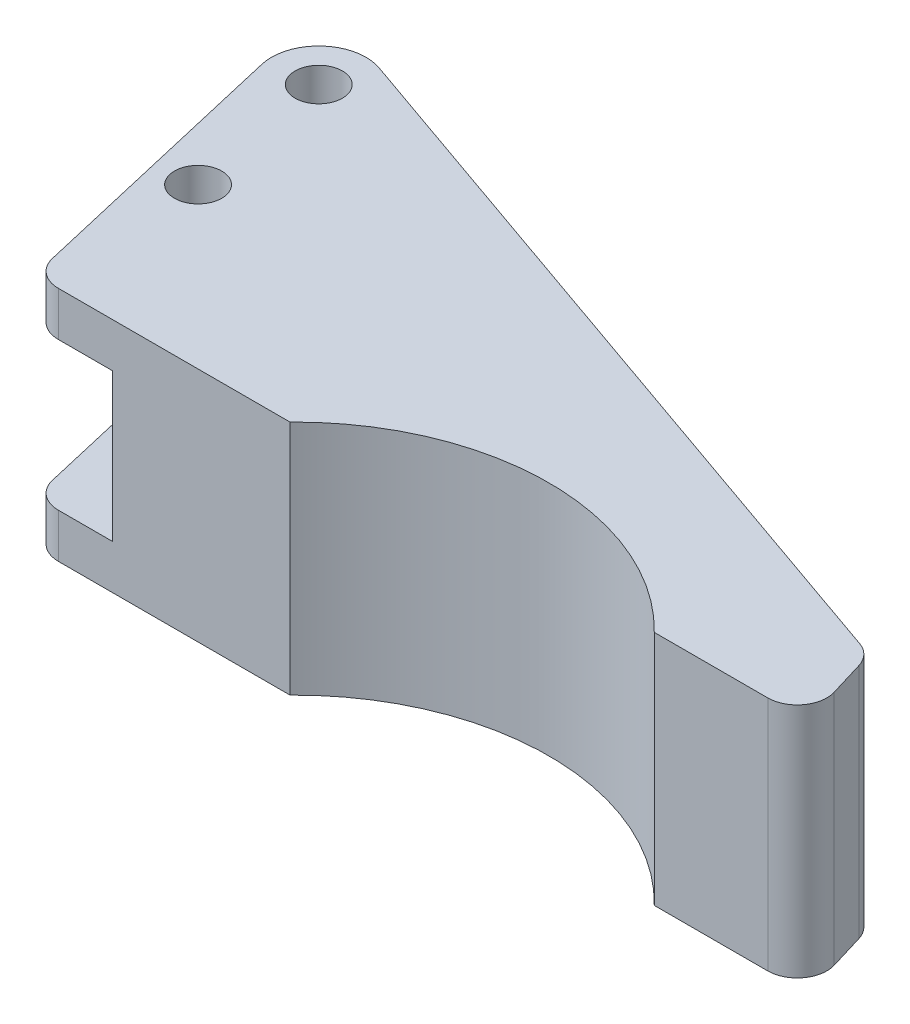
ISO-10303-21;
HEADER;
FILE_DESCRIPTION(('STEP AP214'),'2;1');
FILE_NAME('part.step','',(''),(''),'','','');
FILE_SCHEMA(('AUTOMOTIVE_DESIGN { 1 0 10303 214 1 1 1 1 }'));
ENDSEC;
DATA;
#1=APPLICATION_CONTEXT('core data for automotive mechanical design processes');
#2=APPLICATION_PROTOCOL_DEFINITION('international standard','automotive_design',2000,#1);
#3=PRODUCT_CONTEXT('',#1,'mechanical');
#4=PRODUCT('Part','Part','',(#3));
#5=PRODUCT_RELATED_PRODUCT_CATEGORY('part','',(#4));
#6=PRODUCT_DEFINITION_FORMATION('','',#4);
#7=PRODUCT_DEFINITION_CONTEXT('part definition',#1,'design');
#8=PRODUCT_DEFINITION('design','',#6,#7);
#9=PRODUCT_DEFINITION_SHAPE('','',#8);
#10=(LENGTH_UNIT() NAMED_UNIT(*) SI_UNIT(.MILLI.,.METRE.));
#11=(NAMED_UNIT(*) PLANE_ANGLE_UNIT() SI_UNIT($,.RADIAN.));
#12=(NAMED_UNIT(*) SI_UNIT($,.STERADIAN.) SOLID_ANGLE_UNIT());
#13=UNCERTAINTY_MEASURE_WITH_UNIT(LENGTH_MEASURE(1.E-05),#10,'distance_accuracy_value','');
#14=(GEOMETRIC_REPRESENTATION_CONTEXT(3) GLOBAL_UNCERTAINTY_ASSIGNED_CONTEXT((#13)) GLOBAL_UNIT_ASSIGNED_CONTEXT((#10,
#11,#12)) REPRESENTATION_CONTEXT('',''));
#15=CARTESIAN_POINT('',(0.,0.,0.));
#16=DIRECTION('',(0.,0.,1.));
#17=DIRECTION('',(1.,0.,0.));
#18=AXIS2_PLACEMENT_3D('',#15,#16,#17);
#19=CARTESIAN_POINT('',(-70.,20.,-4.99999999999999));
#20=DIRECTION('',(0.,-1.,0.));
#21=DIRECTION('',(0.,0.,-1.));
#22=AXIS2_PLACEMENT_3D('',#19,#20,#21);
#23=CYLINDRICAL_SURFACE('',#22,5.);
#24=DIRECTION('',(0.,-1.,0.));
#25=VECTOR('',#24,1.);
#26=CARTESIAN_POINT('',(-70.,20.,0.));
#27=LINE('',#26,#25);
#28=CARTESIAN_POINT('',(-70.,-12.5,0.));
#29=VERTEX_POINT('',#28);
#30=CARTESIAN_POINT('',(-70.,-20.,0.));
#31=VERTEX_POINT('',#30);
#32=EDGE_CURVE('E234',#29,#31,#27,.T.);
#33=ORIENTED_EDGE('',*,*,#32,.F.);
#34=CARTESIAN_POINT('',(-70.,-12.5,-4.99999999999999));
#35=DIRECTION('',(0.,-1.,0.));
#36=DIRECTION('',(0.,0.,-1.));
#37=AXIS2_PLACEMENT_3D('',#34,#35,#36);
#38=CIRCLE('',#37,5.);
#39=CARTESIAN_POINT('',(-74.8701653926543,-12.5,-3.86797126883076));
#40=VERTEX_POINT('',#39);
#41=EDGE_CURVE('E262',#29,#40,#38,.T.);
#42=ORIENTED_EDGE('',*,*,#41,.T.);
#43=DIRECTION('',(0.,-1.,0.));
#44=VECTOR('',#43,1.);
#45=CARTESIAN_POINT('',(-74.8701653926543,20.,-3.86797126883076));
#46=LINE('',#45,#44);
#47=CARTESIAN_POINT('',(-74.8701653926543,-20.,-3.86797126883076));
#48=VERTEX_POINT('',#47);
#49=EDGE_CURVE('E104',#40,#48,#46,.T.);
#50=ORIENTED_EDGE('',*,*,#49,.T.);
#51=CARTESIAN_POINT('',(-70.,-20.,-4.99999999999999));
#52=DIRECTION('',(0.,1.,0.));
#53=DIRECTION('',(0.,0.,-1.));
#54=AXIS2_PLACEMENT_3D('',#51,#52,#53);
#55=CIRCLE('',#54,5.);
#56=EDGE_CURVE('E171',#48,#31,#55,.T.);
#57=ORIENTED_EDGE('',*,*,#56,.T.);
#58=EDGE_LOOP('',(#33,#42,#50,#57));
#59=FACE_BOUND('',#58,.T.);
#60=ADVANCED_FACE('F39',(#59),#23,.T.);
#61=CARTESIAN_POINT('',(-77.8145573222842,20.,-51.87));
#62=DIRECTION('',(0.,-1.,0.));
#63=DIRECTION('',(0.,0.,-1.));
#64=AXIS2_PLACEMENT_3D('',#61,#62,#63);
#65=CYLINDRICAL_SURFACE('',#64,8.00000000000001);
#66=CARTESIAN_POINT('',(-77.8145573222842,12.5,-51.87));
#67=DIRECTION('',(0.,1.,0.));
#68=DIRECTION('',(0.,0.,1.));
#69=AXIS2_PLACEMENT_3D('',#66,#67,#68);
#70=CIRCLE('',#69,8.00000000000001);
#71=CARTESIAN_POINT('',(-75.1745573222842,12.5,-59.4218474560865));
#72=VERTEX_POINT('',#71);
#73=CARTESIAN_POINT('',(-85.6068219505311,12.5,-50.0587540301292));
#74=VERTEX_POINT('',#73);
#75=EDGE_CURVE('E253',#72,#74,#70,.T.);
#76=ORIENTED_EDGE('',*,*,#75,.T.);
#77=DIRECTION('',(0.,-1.,0.));
#78=VECTOR('',#77,1.);
#79=CARTESIAN_POINT('',(-85.6068219505311,20.,-50.0587540301292));
#80=LINE('',#79,#78);
#81=CARTESIAN_POINT('',(-85.6068219505311,20.,-50.0587540301292));
#82=VERTEX_POINT('',#81);
#83=EDGE_CURVE('E164',#82,#74,#80,.T.);
#84=ORIENTED_EDGE('',*,*,#83,.F.);
#85=CARTESIAN_POINT('',(-77.8145573222842,20.,-51.87));
#86=DIRECTION('',(0.,1.,0.));
#87=DIRECTION('',(0.,0.,1.));
#88=AXIS2_PLACEMENT_3D('',#85,#86,#87);
#89=CIRCLE('',#88,8.00000000000001);
#90=CARTESIAN_POINT('',(-75.1745573222842,20.,-59.4218474560865));
#91=VERTEX_POINT('',#90);
#92=EDGE_CURVE('E139',#91,#82,#89,.T.);
#93=ORIENTED_EDGE('',*,*,#92,.F.);
#94=DIRECTION('',(0.,-1.,0.));
#95=VECTOR('',#94,1.);
#96=CARTESIAN_POINT('',(-75.1745573222842,20.,-59.4218474560865));
#97=LINE('',#96,#95);
#98=EDGE_CURVE('E150',#91,#72,#97,.T.);
#99=ORIENTED_EDGE('',*,*,#98,.T.);
#100=EDGE_LOOP('',(#76,#84,#93,#99));
#101=FACE_BOUND('',#100,.T.);
#102=ADVANCED_FACE('F162',(#101),#65,.T.);
#103=CARTESIAN_POINT('',(-74.8701653926543,20.,-3.86797126883076));
#104=DIRECTION('',(0.974033078530855,0.,-0.226405746233846));
#105=DIRECTION('',(-0.226405746233846,0.,-0.974033078530855));
#106=AXIS2_PLACEMENT_3D('',#103,#104,#105);
#107=PLANE('',#106);
#108=ORIENTED_EDGE('',*,*,#49,.F.);
#109=DIRECTION('',(-0.226405746233846,0.,-0.974033078530855));
#110=VECTOR('',#109,1.);
#111=CARTESIAN_POINT('',(-74.8701653926543,-12.5,-3.86797126883076));
#112=LINE('',#111,#110);
#113=CARTESIAN_POINT('',(-85.6068219505311,-12.5,-50.0587540301292));
#114=VERTEX_POINT('',#113);
#115=EDGE_CURVE('E251',#40,#114,#112,.T.);
#116=ORIENTED_EDGE('',*,*,#115,.T.);
#117=CARTESIAN_POINT('',(-85.6068219505311,-20.,-50.0587540301292));
#118=VERTEX_POINT('',#117);
#119=EDGE_CURVE('E209',#114,#118,#80,.T.);
#120=ORIENTED_EDGE('',*,*,#119,.T.);
#121=DIRECTION('',(0.226405746233846,0.,0.974033078530855));
#122=VECTOR('',#121,1.);
#123=CARTESIAN_POINT('',(-74.8701653926543,-20.,-3.86797126883076));
#124=LINE('',#123,#122);
#125=EDGE_CURVE('E201',#118,#48,#124,.T.);
#126=ORIENTED_EDGE('',*,*,#125,.T.);
#127=EDGE_LOOP('',(#108,#116,#120,#126));
#128=FACE_BOUND('',#127,.T.);
#129=ADVANCED_FACE('F330',(#128),#107,.F.);
#130=CARTESIAN_POINT('',(-77.8145573222842,20.,-51.87));
#131=DIRECTION('',(0.,-1.,0.));
#132=DIRECTION('',(0.,0.,-1.));
#133=AXIS2_PLACEMENT_3D('',#130,#131,#132);
#134=CYLINDRICAL_SURFACE('',#133,4.00000000000001);
#135=CARTESIAN_POINT('',(-77.8145573222842,-12.5,-51.87));
#136=DIRECTION('',(0.,-1.,0.));
#137=DIRECTION('',(0.,0.,-1.));
#138=AXIS2_PLACEMENT_3D('',#135,#136,#137);
#139=CIRCLE('',#138,4.00000000000001);
#140=CARTESIAN_POINT('',(-77.8145573222842,-12.5,-55.87));
#141=VERTEX_POINT('',#140);
#142=EDGE_CURVE('E245',#141,#141,#139,.T.);
#143=ORIENTED_EDGE('',*,*,#142,.F.);
#144=EDGE_LOOP('',(#143));
#145=FACE_BOUND('',#144,.T.);
#146=CARTESIAN_POINT('',(-77.8145573222842,-20.,-51.87));
#147=DIRECTION('',(0.,1.,0.));
#148=DIRECTION('',(0.,0.,1.));
#149=AXIS2_PLACEMENT_3D('',#146,#147,#148);
#150=CIRCLE('',#149,4.00000000000001);
#151=CARTESIAN_POINT('',(-77.8145573222842,-20.,-47.87));
#152=VERTEX_POINT('',#151);
#153=EDGE_CURVE('E278',#152,#152,#150,.T.);
#154=ORIENTED_EDGE('',*,*,#153,.F.);
#155=EDGE_LOOP('',(#154));
#156=FACE_BOUND('',#155,.T.);
#157=ADVANCED_FACE('F494',(#145,#156),#134,.F.);
#158=CARTESIAN_POINT('',(-73.3600000000001,20.,-27.));
#159=DIRECTION('',(0.,-1.,0.));
#160=DIRECTION('',(0.,0.,-1.));
#161=AXIS2_PLACEMENT_3D('',#158,#159,#160);
#162=CYLINDRICAL_SURFACE('',#161,4.00000000000001);
#163=CARTESIAN_POINT('',(-73.3600000000001,-12.5,-27.));
#164=DIRECTION('',(0.,-1.,0.));
#165=DIRECTION('',(0.,0.,-1.));
#166=AXIS2_PLACEMENT_3D('',#163,#164,#165);
#167=CIRCLE('',#166,4.00000000000001);
#168=CARTESIAN_POINT('',(-73.3600000000001,-12.5,-31.));
#169=VERTEX_POINT('',#168);
#170=EDGE_CURVE('E242',#169,#169,#167,.T.);
#171=ORIENTED_EDGE('',*,*,#170,.F.);
#172=EDGE_LOOP('',(#171));
#173=FACE_BOUND('',#172,.T.);
#174=CARTESIAN_POINT('',(-73.3600000000001,-20.,-27.));
#175=DIRECTION('',(0.,1.,0.));
#176=DIRECTION('',(0.,0.,1.));
#177=AXIS2_PLACEMENT_3D('',#174,#175,#176);
#178=CIRCLE('',#177,4.00000000000001);
#179=CARTESIAN_POINT('',(-73.3600000000001,-20.,-23.));
#180=VERTEX_POINT('',#179);
#181=EDGE_CURVE('E273',#180,#180,#178,.T.);
#182=ORIENTED_EDGE('',*,*,#181,.F.);
#183=EDGE_LOOP('',(#182));
#184=FACE_BOUND('',#183,.T.);
#185=ADVANCED_FACE('F433',(#173,#184),#162,.F.);
#186=CARTESIAN_POINT('',(-70.,20.,-4.99999999999999));
#187=DIRECTION('',(0.,-1.,0.));
#188=DIRECTION('',(0.,0.,-1.));
#189=AXIS2_PLACEMENT_3D('',#186,#187,#188);
#190=PLANE('',#189);
#191=CARTESIAN_POINT('',(-70.,20.,-4.99999999999999));
#192=DIRECTION('',(0.,1.,0.));
#193=DIRECTION('',(0.,0.,-1.));
#194=AXIS2_PLACEMENT_3D('',#191,#192,#193);
#195=CIRCLE('',#194,5.);
#196=CARTESIAN_POINT('',(-74.8701653926543,20.,-3.86797126883076));
#197=VERTEX_POINT('',#196);
#198=CARTESIAN_POINT('',(-70.,20.,0.));
#199=VERTEX_POINT('',#198);
#200=EDGE_CURVE('E204',#197,#199,#195,.T.);
#201=ORIENTED_EDGE('',*,*,#200,.T.);
#202=DIRECTION('',(1.,0.,0.));
#203=VECTOR('',#202,1.);
#204=CARTESIAN_POINT('',(-30.8058436014987,20.,0.));
#205=LINE('',#204,#203);
#206=CARTESIAN_POINT('',(-30.8058436014987,20.,0.));
#207=VERTEX_POINT('',#206);
#208=EDGE_CURVE('E113',#199,#207,#205,.T.);
#209=ORIENTED_EDGE('',*,*,#208,.T.);
#210=CARTESIAN_POINT('',(0.,20.,30.));
#211=DIRECTION('',(0.,-1.,0.));
#212=DIRECTION('',(0.,0.,1.));
#213=AXIS2_PLACEMENT_3D('',#210,#211,#212);
#214=CIRCLE('',#213,43.);
#215=CARTESIAN_POINT('',(30.8058436014987,20.,0.));
#216=VERTEX_POINT('',#215);
#217=EDGE_CURVE('E292',#207,#216,#214,.T.);
#218=ORIENTED_EDGE('',*,*,#217,.T.);
#219=DIRECTION('',(1.,0.,0.));
#220=VECTOR('',#219,1.);
#221=CARTESIAN_POINT('',(50.,20.,0.));
#222=LINE('',#221,#220);
#223=CARTESIAN_POINT('',(50.,20.,0.));
#224=VERTEX_POINT('',#223);
#225=EDGE_CURVE('E295',#216,#224,#222,.T.);
#226=ORIENTED_EDGE('',*,*,#225,.T.);
#227=CARTESIAN_POINT('',(50.,20.,-5.));
#228=DIRECTION('',(0.,1.,0.));
#229=DIRECTION('',(0.,0.,-1.));
#230=AXIS2_PLACEMENT_3D('',#227,#228,#229);
#231=CIRCLE('',#230,5.);
#232=CARTESIAN_POINT('',(54.7862589277213,20.,-6.44627987499236));
#233=VERTEX_POINT('',#232);
#234=EDGE_CURVE('E298',#224,#233,#231,.T.);
#235=ORIENTED_EDGE('',*,*,#234,.T.);
#236=DIRECTION('',(-0.289255974998471,0.,-0.957251785544265));
#237=VECTOR('',#236,1.);
#238=CARTESIAN_POINT('',(52.9732188517459,20.,-12.4462798749924));
#239=LINE('',#238,#237);
#240=CARTESIAN_POINT('',(52.9732188517459,20.,-12.4462798749924));
#241=VERTEX_POINT('',#240);
#242=EDGE_CURVE('E301',#233,#241,#239,.T.);
#243=ORIENTED_EDGE('',*,*,#242,.T.);
#244=CARTESIAN_POINT('',(48.1869599240245,20.,-11.));
#245=DIRECTION('',(0.,1.,0.));
#246=DIRECTION('',(0.,0.,1.));
#247=AXIS2_PLACEMENT_3D('',#244,#245,#246);
#248=CIRCLE('',#247,5.00000000000001);
#249=CARTESIAN_POINT('',(49.8369599240245,20.,-15.7199046600541));
#250=VERTEX_POINT('',#249);
#251=EDGE_CURVE('E142',#241,#250,#248,.T.);
#252=ORIENTED_EDGE('',*,*,#251,.T.);
#253=DIRECTION('',(-0.943980932010811,0.,-0.33));
#254=VECTOR('',#253,1.);
#255=CARTESIAN_POINT('',(-75.1745573222842,20.,-59.4218474560865));
#256=LINE('',#255,#254);
#257=EDGE_CURVE('E134',#250,#91,#256,.T.);
#258=ORIENTED_EDGE('',*,*,#257,.T.);
#259=ORIENTED_EDGE('',*,*,#92,.T.);
#260=DIRECTION('',(0.226405746233846,0.,0.974033078530855));
#261=VECTOR('',#260,1.);
#262=CARTESIAN_POINT('',(-74.8701653926543,20.,-3.86797126883076));
#263=LINE('',#262,#261);
#264=EDGE_CURVE('E64',#82,#197,#263,.T.);
#265=ORIENTED_EDGE('',*,*,#264,.T.);
#266=EDGE_LOOP('',(#201,#209,#218,#226,#235,#243,#252,#258,#259,#265));
#267=FACE_BOUND('',#266,.T.);
#268=CARTESIAN_POINT('',(-77.8145573222842,20.,-51.87));
#269=DIRECTION('',(0.,1.,0.));
#270=DIRECTION('',(0.,0.,1.));
#271=AXIS2_PLACEMENT_3D('',#268,#269,#270);
#272=CIRCLE('',#271,4.00000000000001);
#273=CARTESIAN_POINT('',(-77.8145573222842,20.,-47.87));
#274=VERTEX_POINT('',#273);
#275=EDGE_CURVE('E175',#274,#274,#272,.T.);
#276=ORIENTED_EDGE('',*,*,#275,.F.);
#277=EDGE_LOOP('',(#276));
#278=FACE_BOUND('',#277,.T.);
#279=CARTESIAN_POINT('',(-73.3600000000001,20.,-27.));
#280=DIRECTION('',(0.,1.,0.));
#281=DIRECTION('',(0.,0.,1.));
#282=AXIS2_PLACEMENT_3D('',#279,#280,#281);
#283=CIRCLE('',#282,4.00000000000001);
#284=CARTESIAN_POINT('',(-73.3600000000001,20.,-23.));
#285=VERTEX_POINT('',#284);
#286=EDGE_CURVE('E274',#285,#285,#283,.T.);
#287=ORIENTED_EDGE('',*,*,#286,.F.);
#288=EDGE_LOOP('',(#287));
#289=FACE_BOUND('',#288,.T.);
#290=ADVANCED_FACE('F136',(#267,#278,#289),#190,.F.);
#291=CARTESIAN_POINT('',(-70.,-20.,-4.99999999999999));
#292=DIRECTION('',(0.,-1.,0.));
#293=DIRECTION('',(0.,0.,-1.));
#294=AXIS2_PLACEMENT_3D('',#291,#292,#293);
#295=PLANE('',#294);
#296=ORIENTED_EDGE('',*,*,#153,.T.);
#297=EDGE_LOOP('',(#296));
#298=FACE_BOUND('',#297,.T.);
#299=ORIENTED_EDGE('',*,*,#56,.F.);
#300=ORIENTED_EDGE('',*,*,#125,.F.);
#301=CARTESIAN_POINT('',(-77.8145573222842,-20.,-51.87));
#302=DIRECTION('',(0.,1.,0.));
#303=DIRECTION('',(0.,0.,1.));
#304=AXIS2_PLACEMENT_3D('',#301,#302,#303);
#305=CIRCLE('',#304,8.00000000000001);
#306=CARTESIAN_POINT('',(-75.1745573222842,-20.,-59.4218474560865));
#307=VERTEX_POINT('',#306);
#308=EDGE_CURVE('E197',#307,#118,#305,.T.);
#309=ORIENTED_EDGE('',*,*,#308,.F.);
#310=DIRECTION('',(-0.943980932010811,0.,-0.33));
#311=VECTOR('',#310,1.);
#312=CARTESIAN_POINT('',(-75.1745573222842,-20.,-59.4218474560865));
#313=LINE('',#312,#311);
#314=CARTESIAN_POINT('',(49.8369599240245,-20.,-15.7199046600541));
#315=VERTEX_POINT('',#314);
#316=EDGE_CURVE('E193',#315,#307,#313,.T.);
#317=ORIENTED_EDGE('',*,*,#316,.F.);
#318=CARTESIAN_POINT('',(48.1869599240245,-20.,-11.));
#319=DIRECTION('',(0.,1.,0.));
#320=DIRECTION('',(0.,0.,1.));
#321=AXIS2_PLACEMENT_3D('',#318,#319,#320);
#322=CIRCLE('',#321,5.00000000000001);
#323=CARTESIAN_POINT('',(52.9732188517459,-20.,-12.4462798749924));
#324=VERTEX_POINT('',#323);
#325=EDGE_CURVE('E190',#324,#315,#322,.T.);
#326=ORIENTED_EDGE('',*,*,#325,.F.);
#327=DIRECTION('',(-0.289255974998471,0.,-0.957251785544265));
#328=VECTOR('',#327,1.);
#329=CARTESIAN_POINT('',(52.9732188517459,-20.,-12.4462798749924));
#330=LINE('',#329,#328);
#331=CARTESIAN_POINT('',(54.7862589277213,-20.,-6.44627987499236));
#332=VERTEX_POINT('',#331);
#333=EDGE_CURVE('E187',#332,#324,#330,.T.);
#334=ORIENTED_EDGE('',*,*,#333,.F.);
#335=CARTESIAN_POINT('',(50.,-20.,-5.));
#336=DIRECTION('',(0.,1.,0.));
#337=DIRECTION('',(0.,0.,-1.));
#338=AXIS2_PLACEMENT_3D('',#335,#336,#337);
#339=CIRCLE('',#338,5.);
#340=CARTESIAN_POINT('',(50.,-20.,0.));
#341=VERTEX_POINT('',#340);
#342=EDGE_CURVE('E184',#341,#332,#339,.T.);
#343=ORIENTED_EDGE('',*,*,#342,.F.);
#344=DIRECTION('',(1.,0.,0.));
#345=VECTOR('',#344,1.);
#346=CARTESIAN_POINT('',(50.,-20.,0.));
#347=LINE('',#346,#345);
#348=CARTESIAN_POINT('',(30.8058436014987,-20.,0.));
#349=VERTEX_POINT('',#348);
#350=EDGE_CURVE('E181',#349,#341,#347,.T.);
#351=ORIENTED_EDGE('',*,*,#350,.F.);
#352=CARTESIAN_POINT('',(0.,-20.,30.));
#353=DIRECTION('',(0.,-1.,0.));
#354=DIRECTION('',(0.,0.,1.));
#355=AXIS2_PLACEMENT_3D('',#352,#353,#354);
#356=CIRCLE('',#355,43.);
#357=CARTESIAN_POINT('',(-30.8058436014987,-20.,0.));
#358=VERTEX_POINT('',#357);
#359=EDGE_CURVE('E178',#358,#349,#356,.T.);
#360=ORIENTED_EDGE('',*,*,#359,.F.);
#361=DIRECTION('',(1.,0.,0.));
#362=VECTOR('',#361,1.);
#363=CARTESIAN_POINT('',(-30.8058436014987,-20.,0.));
#364=LINE('',#363,#362);
#365=EDGE_CURVE('E174',#31,#358,#364,.T.);
#366=ORIENTED_EDGE('',*,*,#365,.F.);
#367=EDGE_LOOP('',(#299,#300,#309,#317,#326,#334,#343,#351,#360,#366));
#368=FACE_BOUND('',#367,.T.);
#369=ORIENTED_EDGE('',*,*,#181,.T.);
#370=EDGE_LOOP('',(#369));
#371=FACE_BOUND('',#370,.T.);
#372=ADVANCED_FACE('F318',(#298,#368,#371),#295,.T.);
#373=CARTESIAN_POINT('',(-74.8701653926543,12.5,-3.86797126883076));
#374=VERTEX_POINT('',#373);
#375=EDGE_CURVE('E205',#197,#374,#46,.T.);
#376=ORIENTED_EDGE('',*,*,#375,.T.);
#377=CARTESIAN_POINT('',(-70.,12.5,-4.99999999999999));
#378=DIRECTION('',(0.,1.,0.));
#379=DIRECTION('',(0.,0.,1.));
#380=AXIS2_PLACEMENT_3D('',#377,#378,#379);
#381=CIRCLE('',#380,5.);
#382=CARTESIAN_POINT('',(-70.,12.5,0.));
#383=VERTEX_POINT('',#382);
#384=EDGE_CURVE('E55',#374,#383,#381,.T.);
#385=ORIENTED_EDGE('',*,*,#384,.T.);
#386=EDGE_CURVE('E48',#199,#383,#27,.T.);
#387=ORIENTED_EDGE('',*,*,#386,.F.);
#388=ORIENTED_EDGE('',*,*,#200,.F.);
#389=EDGE_LOOP('',(#376,#385,#387,#388));
#390=FACE_BOUND('',#389,.T.);
#391=ADVANCED_FACE('F41',(#390),#23,.T.);
#392=CARTESIAN_POINT('',(-30.8058436014987,20.,0.));
#393=DIRECTION('',(0.,0.,-1.));
#394=DIRECTION('',(-1.,0.,0.));
#395=AXIS2_PLACEMENT_3D('',#392,#393,#394);
#396=PLANE('',#395);
#397=DIRECTION('',(0.,1.,0.));
#398=VECTOR('',#397,1.);
#399=CARTESIAN_POINT('',(-60.8145573222843,12.5,0.));
#400=LINE('',#399,#398);
#401=CARTESIAN_POINT('',(-60.8145573222843,-12.5,0.));
#402=VERTEX_POINT('',#401);
#403=CARTESIAN_POINT('',(-60.8145573222843,12.5,0.));
#404=VERTEX_POINT('',#403);
#405=EDGE_CURVE('E403',#402,#404,#400,.T.);
#406=ORIENTED_EDGE('',*,*,#405,.F.);
#407=DIRECTION('',(1.,0.,0.));
#408=VECTOR('',#407,1.);
#409=CARTESIAN_POINT('',(-85.8145573222843,-12.5,0.));
#410=LINE('',#409,#408);
#411=EDGE_CURVE('E348',#29,#402,#410,.T.);
#412=ORIENTED_EDGE('',*,*,#411,.F.);
#413=ORIENTED_EDGE('',*,*,#32,.T.);
#414=ORIENTED_EDGE('',*,*,#365,.T.);
#415=DIRECTION('',(0.,-1.,0.));
#416=VECTOR('',#415,1.);
#417=CARTESIAN_POINT('',(-30.8058436014987,20.,0.));
#418=LINE('',#417,#416);
#419=EDGE_CURVE('E230',#207,#358,#418,.T.);
#420=ORIENTED_EDGE('',*,*,#419,.F.);
#421=ORIENTED_EDGE('',*,*,#208,.F.);
#422=ORIENTED_EDGE('',*,*,#386,.T.);
#423=DIRECTION('',(-1.,0.,0.));
#424=VECTOR('',#423,1.);
#425=CARTESIAN_POINT('',(-85.8145573222843,12.5,0.));
#426=LINE('',#425,#424);
#427=EDGE_CURVE('E366',#404,#383,#426,.T.);
#428=ORIENTED_EDGE('',*,*,#427,.F.);
#429=EDGE_LOOP('',(#406,#412,#413,#414,#420,#421,#422,#428));
#430=FACE_BOUND('',#429,.T.);
#431=ADVANCED_FACE('F347',(#430),#396,.F.);
#432=CARTESIAN_POINT('',(0.,20.,30.));
#433=DIRECTION('',(0.,-1.,0.));
#434=DIRECTION('',(0.,0.,-1.));
#435=AXIS2_PLACEMENT_3D('',#432,#433,#434);
#436=CYLINDRICAL_SURFACE('',#435,43.);
#437=ORIENTED_EDGE('',*,*,#359,.T.);
#438=DIRECTION('',(0.,-1.,0.));
#439=VECTOR('',#438,1.);
#440=CARTESIAN_POINT('',(30.8058436014987,20.,0.));
#441=LINE('',#440,#439);
#442=EDGE_CURVE('E226',#216,#349,#441,.T.);
#443=ORIENTED_EDGE('',*,*,#442,.F.);
#444=ORIENTED_EDGE('',*,*,#217,.F.);
#445=ORIENTED_EDGE('',*,*,#419,.T.);
#446=EDGE_LOOP('',(#437,#443,#444,#445));
#447=FACE_BOUND('',#446,.T.);
#448=ADVANCED_FACE('F354',(#447),#436,.F.);
#449=CARTESIAN_POINT('',(50.,20.,0.));
#450=DIRECTION('',(0.,0.,-1.));
#451=DIRECTION('',(-1.,0.,0.));
#452=AXIS2_PLACEMENT_3D('',#449,#450,#451);
#453=PLANE('',#452);
#454=ORIENTED_EDGE('',*,*,#350,.T.);
#455=DIRECTION('',(0.,-1.,0.));
#456=VECTOR('',#455,1.);
#457=CARTESIAN_POINT('',(50.,20.,0.));
#458=LINE('',#457,#456);
#459=EDGE_CURVE('E222',#224,#341,#458,.T.);
#460=ORIENTED_EDGE('',*,*,#459,.F.);
#461=ORIENTED_EDGE('',*,*,#225,.F.);
#462=ORIENTED_EDGE('',*,*,#442,.T.);
#463=EDGE_LOOP('',(#454,#460,#461,#462));
#464=FACE_BOUND('',#463,.T.);
#465=ADVANCED_FACE('F358',(#464),#453,.F.);
#466=CARTESIAN_POINT('',(50.,20.,-5.));
#467=DIRECTION('',(0.,-1.,0.));
#468=DIRECTION('',(0.,0.,-1.));
#469=AXIS2_PLACEMENT_3D('',#466,#467,#468);
#470=CYLINDRICAL_SURFACE('',#469,5.);
#471=ORIENTED_EDGE('',*,*,#342,.T.);
#472=DIRECTION('',(0.,-1.,0.));
#473=VECTOR('',#472,1.);
#474=CARTESIAN_POINT('',(54.7862589277213,20.,-6.44627987499236));
#475=LINE('',#474,#473);
#476=EDGE_CURVE('E218',#233,#332,#475,.T.);
#477=ORIENTED_EDGE('',*,*,#476,.F.);
#478=ORIENTED_EDGE('',*,*,#234,.F.);
#479=ORIENTED_EDGE('',*,*,#459,.T.);
#480=EDGE_LOOP('',(#471,#477,#478,#479));
#481=FACE_BOUND('',#480,.T.);
#482=ADVANCED_FACE('F447',(#481),#470,.T.);
#483=CARTESIAN_POINT('',(52.9732188517459,20.,-12.4462798749924));
#484=DIRECTION('',(-0.957251785544265,0.,0.289255974998471));
#485=DIRECTION('',(0.289255974998471,0.,0.957251785544265));
#486=AXIS2_PLACEMENT_3D('',#483,#484,#485);
#487=PLANE('',#486);
#488=ORIENTED_EDGE('',*,*,#333,.T.);
#489=DIRECTION('',(0.,-1.,0.));
#490=VECTOR('',#489,1.);
#491=CARTESIAN_POINT('',(52.9732188517459,20.,-12.4462798749924));
#492=LINE('',#491,#490);
#493=EDGE_CURVE('E214',#241,#324,#492,.T.);
#494=ORIENTED_EDGE('',*,*,#493,.F.);
#495=ORIENTED_EDGE('',*,*,#242,.F.);
#496=ORIENTED_EDGE('',*,*,#476,.T.);
#497=EDGE_LOOP('',(#488,#494,#495,#496));
#498=FACE_BOUND('',#497,.T.);
#499=ADVANCED_FACE('F309',(#498),#487,.F.);
#500=CARTESIAN_POINT('',(48.1869599240245,20.,-11.));
#501=DIRECTION('',(0.,-1.,0.));
#502=DIRECTION('',(0.,0.,-1.));
#503=AXIS2_PLACEMENT_3D('',#500,#501,#502);
#504=CYLINDRICAL_SURFACE('',#503,5.00000000000001);
#505=ORIENTED_EDGE('',*,*,#325,.T.);
#506=DIRECTION('',(0.,-1.,0.));
#507=VECTOR('',#506,1.);
#508=CARTESIAN_POINT('',(49.8369599240245,20.,-15.7199046600541));
#509=LINE('',#508,#507);
#510=EDGE_CURVE('E159',#250,#315,#509,.T.);
#511=ORIENTED_EDGE('',*,*,#510,.F.);
#512=ORIENTED_EDGE('',*,*,#251,.F.);
#513=ORIENTED_EDGE('',*,*,#493,.T.);
#514=EDGE_LOOP('',(#505,#511,#512,#513));
#515=FACE_BOUND('',#514,.T.);
#516=ADVANCED_FACE('F313',(#515),#504,.T.);
#517=CARTESIAN_POINT('',(-75.1745573222842,20.,-59.4218474560865));
#518=DIRECTION('',(-0.33,0.,0.943980932010811));
#519=DIRECTION('',(0.943980932010811,0.,0.33));
#520=AXIS2_PLACEMENT_3D('',#517,#518,#519);
#521=PLANE('',#520);
#522=CARTESIAN_POINT('',(-75.1745573222842,-12.5,-59.4218474560865));
#523=VERTEX_POINT('',#522);
#524=EDGE_CURVE('E160',#523,#307,#97,.T.);
#525=ORIENTED_EDGE('',*,*,#524,.F.);
#526=DIRECTION('',(0.943980932010811,0.,0.33));
#527=VECTOR('',#526,1.);
#528=CARTESIAN_POINT('',(-75.1745573222842,-12.5,-59.4218474560865));
#529=LINE('',#528,#527);
#530=CARTESIAN_POINT('',(-60.8145573222843,-12.5,-54.4018308018245));
#531=VERTEX_POINT('',#530);
#532=EDGE_CURVE('E267',#523,#531,#529,.T.);
#533=ORIENTED_EDGE('',*,*,#532,.T.);
#534=DIRECTION('',(0.,1.,0.));
#535=VECTOR('',#534,1.);
#536=CARTESIAN_POINT('',(-60.8145573222843,20.,-54.4018308018245));
#537=LINE('',#536,#535);
#538=CARTESIAN_POINT('',(-60.8145573222843,12.5,-54.4018308018245));
#539=VERTEX_POINT('',#538);
#540=EDGE_CURVE('E11',#531,#539,#537,.T.);
#541=ORIENTED_EDGE('',*,*,#540,.T.);
#542=DIRECTION('',(-0.943980932010811,0.,-0.33));
#543=VECTOR('',#542,1.);
#544=CARTESIAN_POINT('',(-75.1745573222842,12.5,-59.4218474560865));
#545=LINE('',#544,#543);
#546=EDGE_CURVE('E155',#539,#72,#545,.T.);
#547=ORIENTED_EDGE('',*,*,#546,.T.);
#548=ORIENTED_EDGE('',*,*,#98,.F.);
#549=ORIENTED_EDGE('',*,*,#257,.F.);
#550=ORIENTED_EDGE('',*,*,#510,.T.);
#551=ORIENTED_EDGE('',*,*,#316,.T.);
#552=EDGE_LOOP('',(#525,#533,#541,#547,#548,#549,#550,#551));
#553=FACE_BOUND('',#552,.T.);
#554=ADVANCED_FACE('F152',(#553),#521,.F.);
#555=ORIENTED_EDGE('',*,*,#119,.F.);
#556=CARTESIAN_POINT('',(-77.8145573222842,-12.5,-51.87));
#557=DIRECTION('',(0.,-1.,0.));
#558=DIRECTION('',(0.,0.,-1.));
#559=AXIS2_PLACEMENT_3D('',#556,#557,#558);
#560=CIRCLE('',#559,8.00000000000001);
#561=EDGE_CURVE('E263',#114,#523,#560,.T.);
#562=ORIENTED_EDGE('',*,*,#561,.T.);
#563=ORIENTED_EDGE('',*,*,#524,.T.);
#564=ORIENTED_EDGE('',*,*,#308,.T.);
#565=EDGE_LOOP('',(#555,#562,#563,#564));
#566=FACE_BOUND('',#565,.T.);
#567=ADVANCED_FACE('F323',(#566),#65,.T.);
#568=ORIENTED_EDGE('',*,*,#83,.T.);
#569=DIRECTION('',(0.226405746233846,0.,0.974033078530855));
#570=VECTOR('',#569,1.);
#571=CARTESIAN_POINT('',(-74.8701653926543,12.5,-3.86797126883076));
#572=LINE('',#571,#570);
#573=EDGE_CURVE('E397',#74,#374,#572,.T.);
#574=ORIENTED_EDGE('',*,*,#573,.T.);
#575=ORIENTED_EDGE('',*,*,#375,.F.);
#576=ORIENTED_EDGE('',*,*,#264,.F.);
#577=EDGE_LOOP('',(#568,#574,#575,#576));
#578=FACE_BOUND('',#577,.T.);
#579=ADVANCED_FACE('F401',(#578),#107,.F.);
#580=CARTESIAN_POINT('',(-77.8145573222842,12.5,-51.87));
#581=DIRECTION('',(0.,1.,0.));
#582=DIRECTION('',(0.,0.,1.));
#583=AXIS2_PLACEMENT_3D('',#580,#581,#582);
#584=CIRCLE('',#583,4.00000000000001);
#585=CARTESIAN_POINT('',(-77.8145573222842,12.5,-47.87));
#586=VERTEX_POINT('',#585);
#587=EDGE_CURVE('E240',#586,#586,#584,.T.);
#588=ORIENTED_EDGE('',*,*,#587,.F.);
#589=EDGE_LOOP('',(#588));
#590=FACE_BOUND('',#589,.T.);
#591=ORIENTED_EDGE('',*,*,#275,.T.);
#592=EDGE_LOOP('',(#591));
#593=FACE_BOUND('',#592,.T.);
#594=ADVANCED_FACE('F438',(#590,#593),#134,.F.);
#595=CARTESIAN_POINT('',(-73.3600000000001,12.5,-27.));
#596=DIRECTION('',(0.,1.,0.));
#597=DIRECTION('',(0.,0.,1.));
#598=AXIS2_PLACEMENT_3D('',#595,#596,#597);
#599=CIRCLE('',#598,4.00000000000001);
#600=CARTESIAN_POINT('',(-73.3600000000001,12.5,-23.));
#601=VERTEX_POINT('',#600);
#602=EDGE_CURVE('E237',#601,#601,#599,.T.);
#603=ORIENTED_EDGE('',*,*,#602,.F.);
#604=EDGE_LOOP('',(#603));
#605=FACE_BOUND('',#604,.T.);
#606=ORIENTED_EDGE('',*,*,#286,.T.);
#607=EDGE_LOOP('',(#606));
#608=FACE_BOUND('',#607,.T.);
#609=ADVANCED_FACE('F492',(#605,#608),#162,.F.);
#610=CARTESIAN_POINT('',(-60.8145573222843,12.5,-59.87));
#611=DIRECTION('',(1.,0.,0.));
#612=DIRECTION('',(0.,0.,-1.));
#613=AXIS2_PLACEMENT_3D('',#610,#611,#612);
#614=PLANE('',#613);
#615=DIRECTION('',(0.,0.,1.));
#616=VECTOR('',#615,1.);
#617=CARTESIAN_POINT('',(-60.8145573222843,-12.5,-59.87));
#618=LINE('',#617,#616);
#619=EDGE_CURVE('E241',#531,#402,#618,.T.);
#620=ORIENTED_EDGE('',*,*,#619,.T.);
#621=ORIENTED_EDGE('',*,*,#405,.T.);
#622=DIRECTION('',(0.,0.,1.));
#623=VECTOR('',#622,1.);
#624=CARTESIAN_POINT('',(-60.8145573222843,12.5,-59.87));
#625=LINE('',#624,#623);
#626=EDGE_CURVE('E386',#539,#404,#625,.T.);
#627=ORIENTED_EDGE('',*,*,#626,.F.);
#628=ORIENTED_EDGE('',*,*,#540,.F.);
#629=EDGE_LOOP('',(#620,#621,#627,#628));
#630=FACE_BOUND('',#629,.T.);
#631=ADVANCED_FACE('F384',(#630),#614,.F.);
#632=CARTESIAN_POINT('',(-85.8145573222843,-12.5,-59.87));
#633=DIRECTION('',(0.,-1.,0.));
#634=DIRECTION('',(0.,0.,-1.));
#635=AXIS2_PLACEMENT_3D('',#632,#633,#634);
#636=PLANE('',#635);
#637=ORIENTED_EDGE('',*,*,#142,.T.);
#638=EDGE_LOOP('',(#637));
#639=FACE_BOUND('',#638,.T.);
#640=ORIENTED_EDGE('',*,*,#170,.T.);
#641=EDGE_LOOP('',(#640));
#642=FACE_BOUND('',#641,.T.);
#643=ORIENTED_EDGE('',*,*,#561,.F.);
#644=ORIENTED_EDGE('',*,*,#115,.F.);
#645=ORIENTED_EDGE('',*,*,#41,.F.);
#646=ORIENTED_EDGE('',*,*,#411,.T.);
#647=ORIENTED_EDGE('',*,*,#619,.F.);
#648=ORIENTED_EDGE('',*,*,#532,.F.);
#649=EDGE_LOOP('',(#643,#644,#645,#646,#647,#648));
#650=FACE_BOUND('',#649,.T.);
#651=ADVANCED_FACE('F335',(#639,#642,#650),#636,.F.);
#652=CARTESIAN_POINT('',(-85.8145573222843,12.5,-59.87));
#653=DIRECTION('',(0.,1.,0.));
#654=DIRECTION('',(0.,0.,1.));
#655=AXIS2_PLACEMENT_3D('',#652,#653,#654);
#656=PLANE('',#655);
#657=ORIENTED_EDGE('',*,*,#587,.T.);
#658=EDGE_LOOP('',(#657));
#659=FACE_BOUND('',#658,.T.);
#660=ORIENTED_EDGE('',*,*,#602,.T.);
#661=EDGE_LOOP('',(#660));
#662=FACE_BOUND('',#661,.T.);
#663=ORIENTED_EDGE('',*,*,#626,.T.);
#664=ORIENTED_EDGE('',*,*,#427,.T.);
#665=ORIENTED_EDGE('',*,*,#384,.F.);
#666=ORIENTED_EDGE('',*,*,#573,.F.);
#667=ORIENTED_EDGE('',*,*,#75,.F.);
#668=ORIENTED_EDGE('',*,*,#546,.F.);
#669=EDGE_LOOP('',(#663,#664,#665,#666,#667,#668));
#670=FACE_BOUND('',#669,.T.);
#671=ADVANCED_FACE('F402',(#659,#662,#670),#656,.F.);
#672=CLOSED_SHELL('',(#60,#102,#129,#157,#185,#290,#372,#391,#431,#448,#465,#482,#499,#516,#554,
#567,#579,#594,#609,#631,#651,#671));
#673=MANIFOLD_SOLID_BREP('B2',#672);
#674=ADVANCED_BREP_SHAPE_REPRESENTATION('',(#18,#673),#14);
#675=SHAPE_DEFINITION_REPRESENTATION(#9,#674);
ENDSEC;
END-ISO-10303-21;
